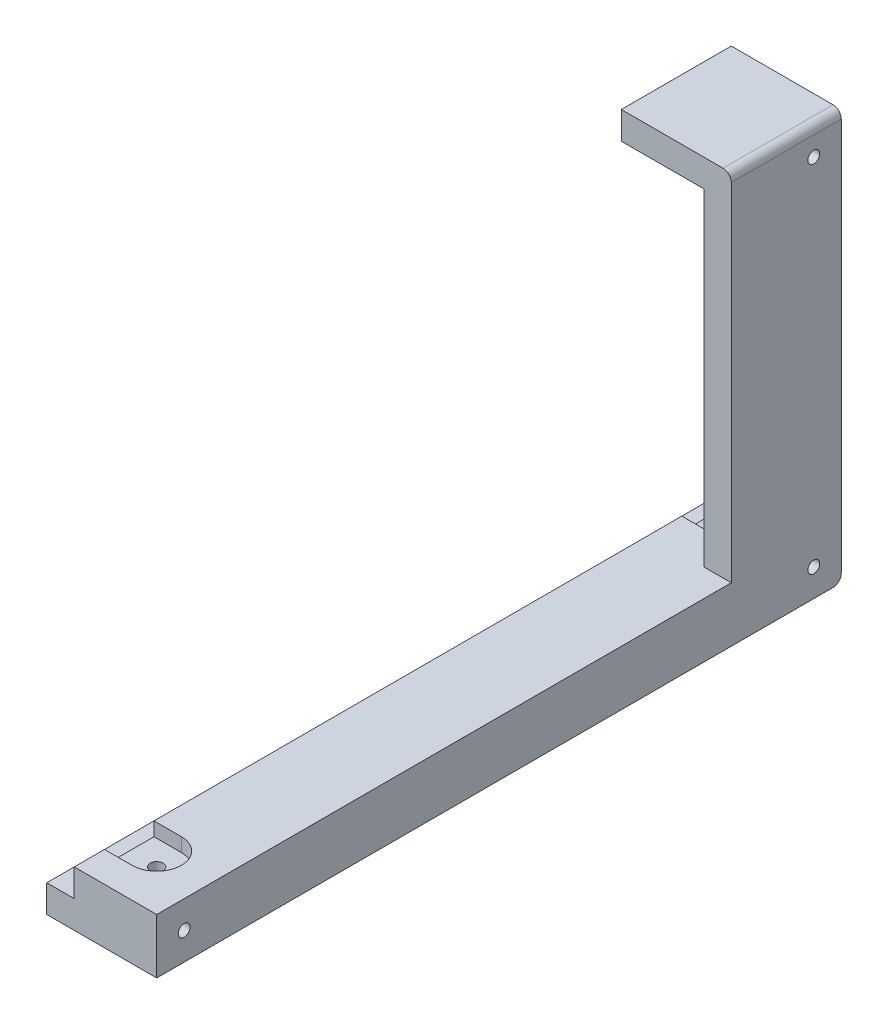
ISO-10303-21;
HEADER;
FILE_DESCRIPTION(('STEP AP214'),'2;1');
FILE_NAME('part.step','',(''),(''),'','','');
FILE_SCHEMA(('AUTOMOTIVE_DESIGN { 1 0 10303 214 1 1 1 1 }'));
ENDSEC;
DATA;
#1=APPLICATION_CONTEXT('core data for automotive mechanical design processes');
#2=APPLICATION_PROTOCOL_DEFINITION('international standard','automotive_design',2000,#1);
#3=PRODUCT_CONTEXT('',#1,'mechanical');
#4=PRODUCT('Part','Part','',(#3));
#5=PRODUCT_RELATED_PRODUCT_CATEGORY('part','',(#4));
#6=PRODUCT_DEFINITION_FORMATION('','',#4);
#7=PRODUCT_DEFINITION_CONTEXT('part definition',#1,'design');
#8=PRODUCT_DEFINITION('design','',#6,#7);
#9=PRODUCT_DEFINITION_SHAPE('','',#8);
#10=(LENGTH_UNIT() NAMED_UNIT(*) SI_UNIT(.MILLI.,.METRE.));
#11=(NAMED_UNIT(*) PLANE_ANGLE_UNIT() SI_UNIT($,.RADIAN.));
#12=(NAMED_UNIT(*) SI_UNIT($,.STERADIAN.) SOLID_ANGLE_UNIT());
#13=UNCERTAINTY_MEASURE_WITH_UNIT(LENGTH_MEASURE(1.E-05),#10,'distance_accuracy_value','');
#14=(GEOMETRIC_REPRESENTATION_CONTEXT(3) GLOBAL_UNCERTAINTY_ASSIGNED_CONTEXT((#13)) GLOBAL_UNIT_ASSIGNED_CONTEXT((#10,
#11,#12)) REPRESENTATION_CONTEXT('',''));
#15=CARTESIAN_POINT('',(0.,0.,0.));
#16=DIRECTION('',(0.,0.,1.));
#17=DIRECTION('',(1.,0.,0.));
#18=AXIS2_PLACEMENT_3D('',#15,#16,#17);
#19=CARTESIAN_POINT('',(0.,-3.00000000000001,-105.5));
#20=DIRECTION('',(0.,1.,0.));
#21=DIRECTION('',(0.,0.,-1.));
#22=AXIS2_PLACEMENT_3D('',#19,#20,#21);
#23=CYLINDRICAL_SURFACE('',#22,2.35);
#24=CARTESIAN_POINT('',(0.,0.,-105.5));
#25=DIRECTION('',(0.,1.,0.));
#26=DIRECTION('',(0.,0.,1.));
#27=AXIS2_PLACEMENT_3D('',#24,#25,#26);
#28=CIRCLE('',#27,2.35);
#29=CARTESIAN_POINT('',(0.,0.,-103.15));
#30=VERTEX_POINT('',#29);
#31=EDGE_CURVE('E253',#30,#30,#28,.T.);
#32=ORIENTED_EDGE('',*,*,#31,.F.);
#33=EDGE_LOOP('',(#32));
#34=FACE_BOUND('',#33,.T.);
#35=CARTESIAN_POINT('',(0.,15.,-105.5));
#36=DIRECTION('',(0.,-1.,0.));
#37=DIRECTION('',(0.,0.,-1.));
#38=AXIS2_PLACEMENT_3D('',#35,#36,#37);
#39=CIRCLE('',#38,2.35);
#40=CARTESIAN_POINT('',(0.,15.,-107.85));
#41=VERTEX_POINT('',#40);
#42=EDGE_CURVE('E263',#41,#41,#39,.F.);
#43=ORIENTED_EDGE('',*,*,#42,.T.);
#44=EDGE_LOOP('',(#43));
#45=FACE_BOUND('',#44,.T.);
#46=ADVANCED_FACE('F39',(#34,#45),#23,.F.);
#47=CARTESIAN_POINT('',(0.,-3.00000000000001,104.5));
#48=DIRECTION('',(0.,1.,0.));
#49=DIRECTION('',(0.,0.,-1.));
#50=AXIS2_PLACEMENT_3D('',#47,#48,#49);
#51=CYLINDRICAL_SURFACE('',#50,2.35);
#52=CARTESIAN_POINT('',(0.,0.,104.5));
#53=DIRECTION('',(0.,1.,0.));
#54=DIRECTION('',(0.,0.,1.));
#55=AXIS2_PLACEMENT_3D('',#52,#53,#54);
#56=CIRCLE('',#55,2.35);
#57=CARTESIAN_POINT('',(0.,0.,106.85));
#58=VERTEX_POINT('',#57);
#59=EDGE_CURVE('E256',#58,#58,#56,.T.);
#60=ORIENTED_EDGE('',*,*,#59,.F.);
#61=EDGE_LOOP('',(#60));
#62=FACE_BOUND('',#61,.T.);
#63=CARTESIAN_POINT('',(0.,15.,104.5));
#64=DIRECTION('',(0.,-1.,0.));
#65=DIRECTION('',(0.,0.,-1.));
#66=AXIS2_PLACEMENT_3D('',#63,#64,#65);
#67=CIRCLE('',#66,2.35);
#68=CARTESIAN_POINT('',(0.,15.,102.15));
#69=VERTEX_POINT('',#68);
#70=EDGE_CURVE('E260',#69,#69,#67,.F.);
#71=ORIENTED_EDGE('',*,*,#70,.T.);
#72=EDGE_LOOP('',(#71));
#73=FACE_BOUND('',#72,.T.);
#74=ADVANCED_FACE('F445',(#62,#73),#51,.F.);
#75=CARTESIAN_POINT('',(-10.,120.,124.5));
#76=DIRECTION('',(-1.,0.,0.));
#77=DIRECTION('',(0.,0.,-1.));
#78=AXIS2_PLACEMENT_3D('',#75,#76,#77);
#79=PLANE('',#78);
#80=DIRECTION('',(0.,1.,0.));
#81=VECTOR('',#80,1.);
#82=CARTESIAN_POINT('',(-9.99999999999997,15.,95.5));
#83=LINE('',#82,#81);
#84=CARTESIAN_POINT('',(-9.99999999999997,15.,95.5));
#85=VERTEX_POINT('',#84);
#86=CARTESIAN_POINT('',(-9.99999999999997,20.,95.5));
#87=VERTEX_POINT('',#86);
#88=EDGE_CURVE('E381',#85,#87,#83,.T.);
#89=ORIENTED_EDGE('',*,*,#88,.T.);
#90=DIRECTION('',(0.,0.,1.));
#91=VECTOR('',#90,1.);
#92=CARTESIAN_POINT('',(-9.99999999999998,20.,0.));
#93=LINE('',#92,#91);
#94=CARTESIAN_POINT('',(-10.,20.,-96.5));
#95=VERTEX_POINT('',#94);
#96=EDGE_CURVE('E212',#95,#87,#93,.T.);
#97=ORIENTED_EDGE('',*,*,#96,.F.);
#98=DIRECTION('',(0.,-1.,0.));
#99=VECTOR('',#98,1.);
#100=CARTESIAN_POINT('',(-9.99999999999997,120.,-96.5));
#101=LINE('',#100,#99);
#102=CARTESIAN_POINT('',(-9.99999999999997,15.,-96.5));
#103=VERTEX_POINT('',#102);
#104=EDGE_CURVE('E257',#95,#103,#101,.T.);
#105=ORIENTED_EDGE('',*,*,#104,.T.);
#106=DIRECTION('',(0.,0.,1.));
#107=VECTOR('',#106,1.);
#108=CARTESIAN_POINT('',(-10.,15.,124.5));
#109=LINE('',#108,#107);
#110=CARTESIAN_POINT('',(-9.99999999999997,15.,-114.5));
#111=VERTEX_POINT('',#110);
#112=EDGE_CURVE('E267',#111,#103,#109,.T.);
#113=ORIENTED_EDGE('',*,*,#112,.F.);
#114=DIRECTION('',(0.,-1.,0.));
#115=VECTOR('',#114,1.);
#116=CARTESIAN_POINT('',(-9.99999999999997,120.,-114.5));
#117=LINE('',#116,#115);
#118=CARTESIAN_POINT('',(-9.99999999999997,10.,-114.5));
#119=VERTEX_POINT('',#118);
#120=EDGE_CURVE('E200',#111,#119,#117,.T.);
#121=ORIENTED_EDGE('',*,*,#120,.T.);
#122=DIRECTION('',(0.,0.,1.));
#123=VECTOR('',#122,1.);
#124=CARTESIAN_POINT('',(-10.,10.,124.5));
#125=LINE('',#124,#123);
#126=CARTESIAN_POINT('',(-10.,10.,124.5));
#127=VERTEX_POINT('',#126);
#128=EDGE_CURVE('E310',#119,#127,#125,.T.);
#129=ORIENTED_EDGE('',*,*,#128,.T.);
#130=DIRECTION('',(0.,-1.,0.));
#131=VECTOR('',#130,1.);
#132=CARTESIAN_POINT('',(-10.,120.,124.5));
#133=LINE('',#132,#131);
#134=CARTESIAN_POINT('',(-10.,20.,124.5));
#135=VERTEX_POINT('',#134);
#136=EDGE_CURVE('E199',#135,#127,#133,.T.);
#137=ORIENTED_EDGE('',*,*,#136,.F.);
#138=CARTESIAN_POINT('',(-9.99999999999997,20.,113.5));
#139=VERTEX_POINT('',#138);
#140=EDGE_CURVE('E203',#139,#135,#93,.T.);
#141=ORIENTED_EDGE('',*,*,#140,.F.);
#142=DIRECTION('',(0.,1.,0.));
#143=VECTOR('',#142,1.);
#144=CARTESIAN_POINT('',(-9.99999999999997,15.,113.5));
#145=LINE('',#144,#143);
#146=CARTESIAN_POINT('',(-9.99999999999997,15.,113.5));
#147=VERTEX_POINT('',#146);
#148=EDGE_CURVE('E377',#147,#139,#145,.T.);
#149=ORIENTED_EDGE('',*,*,#148,.F.);
#150=DIRECTION('',(0.,0.,-1.));
#151=VECTOR('',#150,1.);
#152=CARTESIAN_POINT('',(-9.99999999999997,15.,95.5));
#153=LINE('',#152,#151);
#154=EDGE_CURVE('E391',#147,#85,#153,.T.);
#155=ORIENTED_EDGE('',*,*,#154,.T.);
#156=EDGE_LOOP('',(#89,#97,#105,#113,#121,#129,#137,#141,#149,#155));
#157=FACE_BOUND('',#156,.T.);
#158=ADVANCED_FACE('F322',(#157),#79,.T.);
#159=CARTESIAN_POINT('',(0.,20.,0.));
#160=DIRECTION('',(0.,-1.,0.));
#161=DIRECTION('',(0.,0.,1.));
#162=AXIS2_PLACEMENT_3D('',#159,#160,#161);
#163=PLANE('',#162);
#164=CARTESIAN_POINT('',(0.,20.,104.5));
#165=DIRECTION('',(0.,-1.,0.));
#166=DIRECTION('',(0.,0.,-1.));
#167=AXIS2_PLACEMENT_3D('',#164,#165,#166);
#168=CIRCLE('',#167,8.99999999999999);
#169=CARTESIAN_POINT('',(0.,20.,95.5));
#170=VERTEX_POINT('',#169);
#171=CARTESIAN_POINT('',(0.,20.,113.5));
#172=VERTEX_POINT('',#171);
#173=EDGE_CURVE('E357',#170,#172,#168,.T.);
#174=ORIENTED_EDGE('',*,*,#173,.T.);
#175=DIRECTION('',(-1.,0.,0.));
#176=VECTOR('',#175,1.);
#177=CARTESIAN_POINT('',(-9.99999999999997,20.,113.5));
#178=LINE('',#177,#176);
#179=EDGE_CURVE('E360',#172,#139,#178,.T.);
#180=ORIENTED_EDGE('',*,*,#179,.T.);
#181=ORIENTED_EDGE('',*,*,#140,.T.);
#182=DIRECTION('',(-1.,0.,0.));
#183=VECTOR('',#182,1.);
#184=CARTESIAN_POINT('',(-20.,20.,124.5));
#185=LINE('',#184,#183);
#186=CARTESIAN_POINT('',(20.,20.,124.5));
#187=VERTEX_POINT('',#186);
#188=EDGE_CURVE('E232',#187,#135,#185,.T.);
#189=ORIENTED_EDGE('',*,*,#188,.F.);
#190=DIRECTION('',(0.,0.,1.));
#191=VECTOR('',#190,1.);
#192=CARTESIAN_POINT('',(20.,20.,-124.5));
#193=LINE('',#192,#191);
#194=CARTESIAN_POINT('',(20.,20.,-84.5));
#195=VERTEX_POINT('',#194);
#196=EDGE_CURVE('E229',#195,#187,#193,.T.);
#197=ORIENTED_EDGE('',*,*,#196,.F.);
#198=DIRECTION('',(-1.,0.,0.));
#199=VECTOR('',#198,1.);
#200=CARTESIAN_POINT('',(-20.,20.,-84.5));
#201=LINE('',#200,#199);
#202=CARTESIAN_POINT('',(10.,20.,-84.5));
#203=VERTEX_POINT('',#202);
#204=EDGE_CURVE('E217',#195,#203,#201,.T.);
#205=ORIENTED_EDGE('',*,*,#204,.T.);
#206=DIRECTION('',(0.,0.,-1.));
#207=VECTOR('',#206,1.);
#208=CARTESIAN_POINT('',(10.,20.,-114.5));
#209=LINE('',#208,#207);
#210=CARTESIAN_POINT('',(10.,20.,-114.5));
#211=VERTEX_POINT('',#210);
#212=EDGE_CURVE('E338',#203,#211,#209,.T.);
#213=ORIENTED_EDGE('',*,*,#212,.T.);
#214=DIRECTION('',(-1.,0.,0.));
#215=VECTOR('',#214,1.);
#216=CARTESIAN_POINT('',(10.,20.,-114.5));
#217=LINE('',#216,#215);
#218=CARTESIAN_POINT('',(0.,20.,-114.5));
#219=VERTEX_POINT('',#218);
#220=EDGE_CURVE('E313',#211,#219,#217,.T.);
#221=ORIENTED_EDGE('',*,*,#220,.T.);
#222=CARTESIAN_POINT('',(0.,20.,-105.5));
#223=DIRECTION('',(0.,-1.,0.));
#224=DIRECTION('',(0.,0.,-1.));
#225=AXIS2_PLACEMENT_3D('',#222,#223,#224);
#226=CIRCLE('',#225,8.99999999999999);
#227=CARTESIAN_POINT('',(0.,20.,-96.5));
#228=VERTEX_POINT('',#227);
#229=EDGE_CURVE('E346',#219,#228,#226,.T.);
#230=ORIENTED_EDGE('',*,*,#229,.T.);
#231=DIRECTION('',(-1.,0.,0.));
#232=VECTOR('',#231,1.);
#233=CARTESIAN_POINT('',(0.,20.,-96.5));
#234=LINE('',#233,#232);
#235=EDGE_CURVE('E358',#228,#95,#234,.T.);
#236=ORIENTED_EDGE('',*,*,#235,.T.);
#237=ORIENTED_EDGE('',*,*,#96,.T.);
#238=DIRECTION('',(1.,0.,0.));
#239=VECTOR('',#238,1.);
#240=CARTESIAN_POINT('',(0.,20.,95.5));
#241=LINE('',#240,#239);
#242=EDGE_CURVE('E384',#87,#170,#241,.T.);
#243=ORIENTED_EDGE('',*,*,#242,.T.);
#244=EDGE_LOOP('',(#174,#180,#181,#189,#197,#205,#213,#221,#230,#236,#237,#243));
#245=FACE_BOUND('',#244,.T.);
#246=ADVANCED_FACE('F344',(#245),#163,.F.);
#247=CARTESIAN_POINT('',(-20.,20.,124.5));
#248=DIRECTION('',(0.,0.,-1.));
#249=DIRECTION('',(1.,0.,0.));
#250=AXIS2_PLACEMENT_3D('',#247,#248,#249);
#251=PLANE('',#250);
#252=ORIENTED_EDGE('',*,*,#136,.T.);
#253=DIRECTION('',(-1.,0.,0.));
#254=VECTOR('',#253,1.);
#255=CARTESIAN_POINT('',(-10.,10.,124.5));
#256=LINE('',#255,#254);
#257=CARTESIAN_POINT('',(-20.,10.,124.5));
#258=VERTEX_POINT('',#257);
#259=EDGE_CURVE('E305',#127,#258,#256,.T.);
#260=ORIENTED_EDGE('',*,*,#259,.T.);
#261=DIRECTION('',(0.,-1.,0.));
#262=VECTOR('',#261,1.);
#263=CARTESIAN_POINT('',(-20.,20.,124.5));
#264=LINE('',#263,#262);
#265=CARTESIAN_POINT('',(-20.,0.,124.5));
#266=VERTEX_POINT('',#265);
#267=EDGE_CURVE('E246',#258,#266,#264,.T.);
#268=ORIENTED_EDGE('',*,*,#267,.T.);
#269=DIRECTION('',(-1.,0.,0.));
#270=VECTOR('',#269,1.);
#271=CARTESIAN_POINT('',(-20.,0.,124.5));
#272=LINE('',#271,#270);
#273=CARTESIAN_POINT('',(20.,0.,124.5));
#274=VERTEX_POINT('',#273);
#275=EDGE_CURVE('E237',#274,#266,#272,.T.);
#276=ORIENTED_EDGE('',*,*,#275,.F.);
#277=DIRECTION('',(0.,-1.,0.));
#278=VECTOR('',#277,1.);
#279=CARTESIAN_POINT('',(20.,20.,124.5));
#280=LINE('',#279,#278);
#281=EDGE_CURVE('E249',#187,#274,#280,.T.);
#282=ORIENTED_EDGE('',*,*,#281,.F.);
#283=ORIENTED_EDGE('',*,*,#188,.T.);
#284=EDGE_LOOP('',(#252,#260,#268,#276,#282,#283));
#285=FACE_BOUND('',#284,.T.);
#286=ADVANCED_FACE('F304',(#285),#251,.F.);
#287=CARTESIAN_POINT('',(-20.,20.,-124.5));
#288=DIRECTION('',(1.,0.,0.));
#289=DIRECTION('',(0.,0.,1.));
#290=AXIS2_PLACEMENT_3D('',#287,#288,#289);
#291=PLANE('',#290);
#292=DIRECTION('',(0.,0.,-1.));
#293=VECTOR('',#292,1.);
#294=CARTESIAN_POINT('',(-20.,0.,-124.5));
#295=LINE('',#294,#293);
#296=CARTESIAN_POINT('',(-20.,0.,-121.5));
#297=VERTEX_POINT('',#296);
#298=EDGE_CURVE('E233',#266,#297,#295,.T.);
#299=ORIENTED_EDGE('',*,*,#298,.F.);
#300=ORIENTED_EDGE('',*,*,#267,.F.);
#301=DIRECTION('',(0.,0.,-1.));
#302=VECTOR('',#301,1.);
#303=CARTESIAN_POINT('',(-20.,10.,124.5));
#304=LINE('',#303,#302);
#305=CARTESIAN_POINT('',(-20.,10.,-114.5));
#306=VERTEX_POINT('',#305);
#307=EDGE_CURVE('E198',#258,#306,#304,.T.);
#308=ORIENTED_EDGE('',*,*,#307,.T.);
#309=DIRECTION('',(0.,-1.,0.));
#310=VECTOR('',#309,1.);
#311=CARTESIAN_POINT('',(-20.,120.,-114.5));
#312=LINE('',#311,#310);
#313=CARTESIAN_POINT('',(-20.,139.09,-114.5));
#314=VERTEX_POINT('',#313);
#315=EDGE_CURVE('E180',#314,#306,#312,.T.);
#316=ORIENTED_EDGE('',*,*,#315,.F.);
#317=DIRECTION('',(0.,0.,1.));
#318=VECTOR('',#317,1.);
#319=CARTESIAN_POINT('',(-20.,139.09,-114.5));
#320=LINE('',#319,#318);
#321=CARTESIAN_POINT('',(-20.,139.09,-84.5));
#322=VERTEX_POINT('',#321);
#323=EDGE_CURVE('E185',#314,#322,#320,.T.);
#324=ORIENTED_EDGE('',*,*,#323,.T.);
#325=DIRECTION('',(0.,-1.,0.));
#326=VECTOR('',#325,1.);
#327=CARTESIAN_POINT('',(-20.,149.09,-84.5));
#328=LINE('',#327,#326);
#329=CARTESIAN_POINT('',(-20.,149.09,-84.5));
#330=VERTEX_POINT('',#329);
#331=EDGE_CURVE('E222',#330,#322,#328,.T.);
#332=ORIENTED_EDGE('',*,*,#331,.F.);
#333=DIRECTION('',(0.,0.,-1.));
#334=VECTOR('',#333,1.);
#335=CARTESIAN_POINT('',(-20.,149.09,-124.5));
#336=LINE('',#335,#334);
#337=CARTESIAN_POINT('',(-20.,149.09,-124.5));
#338=VERTEX_POINT('',#337);
#339=EDGE_CURVE('E213',#330,#338,#336,.T.);
#340=ORIENTED_EDGE('',*,*,#339,.T.);
#341=DIRECTION('',(0.,-1.,0.));
#342=VECTOR('',#341,1.);
#343=CARTESIAN_POINT('',(-20.,20.,-124.5));
#344=LINE('',#343,#342);
#345=CARTESIAN_POINT('',(-20.,3.,-124.5));
#346=VERTEX_POINT('',#345);
#347=EDGE_CURVE('E243',#338,#346,#344,.T.);
#348=ORIENTED_EDGE('',*,*,#347,.T.);
#349=CARTESIAN_POINT('',(-20.,3.,-121.5));
#350=DIRECTION('',(-1.,0.,0.));
#351=DIRECTION('',(0.,0.,1.));
#352=AXIS2_PLACEMENT_3D('',#349,#350,#351);
#353=CIRCLE('',#352,3.);
#354=EDGE_CURVE('E11',#297,#346,#353,.F.);
#355=ORIENTED_EDGE('',*,*,#354,.F.);
#356=EDGE_LOOP('',(#299,#300,#308,#316,#324,#332,#340,#348,#355));
#357=FACE_BOUND('',#356,.T.);
#358=ADVANCED_FACE('F196',(#357),#291,.F.);
#359=CARTESIAN_POINT('',(-20.,149.09,-84.5));
#360=DIRECTION('',(0.,0.,-1.));
#361=DIRECTION('',(1.,0.,0.));
#362=AXIS2_PLACEMENT_3D('',#359,#360,#361);
#363=PLANE('',#362);
#364=DIRECTION('',(-1.,0.,0.));
#365=VECTOR('',#364,1.);
#366=CARTESIAN_POINT('',(-20.,149.09,-84.5));
#367=LINE('',#366,#365);
#368=CARTESIAN_POINT('',(17.,149.09,-84.5));
#369=VERTEX_POINT('',#368);
#370=EDGE_CURVE('E220',#369,#330,#367,.T.);
#371=ORIENTED_EDGE('',*,*,#370,.T.);
#372=ORIENTED_EDGE('',*,*,#331,.T.);
#373=DIRECTION('',(1.,0.,0.));
#374=VECTOR('',#373,1.);
#375=CARTESIAN_POINT('',(-20.,139.09,-84.5));
#376=LINE('',#375,#374);
#377=CARTESIAN_POINT('',(9.99999999999999,139.09,-84.5));
#378=VERTEX_POINT('',#377);
#379=EDGE_CURVE('E186',#322,#378,#376,.T.);
#380=ORIENTED_EDGE('',*,*,#379,.T.);
#381=DIRECTION('',(0.,-1.,0.));
#382=VECTOR('',#381,1.);
#383=CARTESIAN_POINT('',(10.,20.,-84.5));
#384=LINE('',#383,#382);
#385=EDGE_CURVE('E336',#378,#203,#384,.T.);
#386=ORIENTED_EDGE('',*,*,#385,.T.);
#387=ORIENTED_EDGE('',*,*,#204,.F.);
#388=DIRECTION('',(0.,-1.,0.));
#389=VECTOR('',#388,1.);
#390=CARTESIAN_POINT('',(20.,149.09,-84.5));
#391=LINE('',#390,#389);
#392=CARTESIAN_POINT('',(20.,146.09,-84.5));
#393=VERTEX_POINT('',#392);
#394=EDGE_CURVE('E226',#393,#195,#391,.T.);
#395=ORIENTED_EDGE('',*,*,#394,.F.);
#396=CARTESIAN_POINT('',(17.,146.09,-84.5));
#397=DIRECTION('',(0.,0.,1.));
#398=DIRECTION('',(1.,0.,0.));
#399=AXIS2_PLACEMENT_3D('',#396,#397,#398);
#400=CIRCLE('',#399,3.);
#401=EDGE_CURVE('E269',#369,#393,#400,.F.);
#402=ORIENTED_EDGE('',*,*,#401,.F.);
#403=EDGE_LOOP('',(#371,#372,#380,#386,#387,#395,#402));
#404=FACE_BOUND('',#403,.T.);
#405=ADVANCED_FACE('F290',(#404),#363,.F.);
#406=CARTESIAN_POINT('',(20.,20.,-124.5));
#407=DIRECTION('',(-1.,0.,0.));
#408=DIRECTION('',(0.,0.,-1.));
#409=AXIS2_PLACEMENT_3D('',#406,#407,#408);
#410=PLANE('',#409);
#411=CARTESIAN_POINT('',(20.,10.,114.5));
#412=DIRECTION('',(-1.,0.,0.));
#413=DIRECTION('',(0.,0.,1.));
#414=AXIS2_PLACEMENT_3D('',#411,#412,#413);
#415=CIRCLE('',#414,2.175);
#416=CARTESIAN_POINT('',(20.,10.,116.675));
#417=VERTEX_POINT('',#416);
#418=EDGE_CURVE('E372',#417,#417,#415,.T.);
#419=ORIENTED_EDGE('',*,*,#418,.T.);
#420=EDGE_LOOP('',(#419));
#421=FACE_BOUND('',#420,.T.);
#422=CARTESIAN_POINT('',(20.,10.,-114.5));
#423=DIRECTION('',(-1.,0.,0.));
#424=DIRECTION('',(0.,0.,1.));
#425=AXIS2_PLACEMENT_3D('',#422,#423,#424);
#426=CIRCLE('',#425,2.175);
#427=CARTESIAN_POINT('',(20.,10.,-112.325));
#428=VERTEX_POINT('',#427);
#429=EDGE_CURVE('E407',#428,#428,#426,.T.);
#430=ORIENTED_EDGE('',*,*,#429,.T.);
#431=EDGE_LOOP('',(#430));
#432=FACE_BOUND('',#431,.T.);
#433=CARTESIAN_POINT('',(20.,139.09,-114.5));
#434=DIRECTION('',(-1.,0.,0.));
#435=DIRECTION('',(0.,0.,1.));
#436=AXIS2_PLACEMENT_3D('',#433,#434,#435);
#437=CIRCLE('',#436,2.175);
#438=CARTESIAN_POINT('',(20.,139.09,-112.325));
#439=VERTEX_POINT('',#438);
#440=EDGE_CURVE('E401',#439,#439,#437,.T.);
#441=ORIENTED_EDGE('',*,*,#440,.T.);
#442=EDGE_LOOP('',(#441));
#443=FACE_BOUND('',#442,.T.);
#444=ORIENTED_EDGE('',*,*,#394,.T.);
#445=ORIENTED_EDGE('',*,*,#196,.T.);
#446=ORIENTED_EDGE('',*,*,#281,.T.);
#447=DIRECTION('',(0.,0.,1.));
#448=VECTOR('',#447,1.);
#449=CARTESIAN_POINT('',(20.,0.,-124.5));
#450=LINE('',#449,#448);
#451=CARTESIAN_POINT('',(20.,0.,-121.5));
#452=VERTEX_POINT('',#451);
#453=EDGE_CURVE('E228',#452,#274,#450,.T.);
#454=ORIENTED_EDGE('',*,*,#453,.F.);
#455=CARTESIAN_POINT('',(20.,3.,-121.5));
#456=DIRECTION('',(1.,0.,0.));
#457=DIRECTION('',(0.,0.,-1.));
#458=AXIS2_PLACEMENT_3D('',#455,#456,#457);
#459=CIRCLE('',#458,3.);
#460=CARTESIAN_POINT('',(20.,3.,-124.5));
#461=VERTEX_POINT('',#460);
#462=EDGE_CURVE('E272',#461,#452,#459,.F.);
#463=ORIENTED_EDGE('',*,*,#462,.F.);
#464=DIRECTION('',(0.,-1.,0.));
#465=VECTOR('',#464,1.);
#466=CARTESIAN_POINT('',(20.,20.,-124.5));
#467=LINE('',#466,#465);
#468=CARTESIAN_POINT('',(20.,146.09,-124.5));
#469=VERTEX_POINT('',#468);
#470=EDGE_CURVE('E235',#469,#461,#467,.T.);
#471=ORIENTED_EDGE('',*,*,#470,.F.);
#472=DIRECTION('',(0.,0.,1.));
#473=VECTOR('',#472,1.);
#474=CARTESIAN_POINT('',(20.,146.09,-124.5));
#475=LINE('',#474,#473);
#476=EDGE_CURVE('E274',#393,#469,#475,.F.);
#477=ORIENTED_EDGE('',*,*,#476,.F.);
#478=EDGE_LOOP('',(#444,#445,#446,#454,#463,#471,#477));
#479=FACE_BOUND('',#478,.T.);
#480=ADVANCED_FACE('F295',(#421,#432,#443,#479),#410,.F.);
#481=CARTESIAN_POINT('',(-20.,20.,-124.5));
#482=DIRECTION('',(0.,0.,1.));
#483=DIRECTION('',(-1.,0.,0.));
#484=AXIS2_PLACEMENT_3D('',#481,#482,#483);
#485=PLANE('',#484);
#486=ORIENTED_EDGE('',*,*,#470,.T.);
#487=DIRECTION('',(1.,0.,0.));
#488=VECTOR('',#487,1.);
#489=CARTESIAN_POINT('',(20.,3.,-124.5));
#490=LINE('',#489,#488);
#491=EDGE_CURVE('E60',#346,#461,#490,.T.);
#492=ORIENTED_EDGE('',*,*,#491,.F.);
#493=ORIENTED_EDGE('',*,*,#347,.F.);
#494=DIRECTION('',(1.,0.,0.));
#495=VECTOR('',#494,1.);
#496=CARTESIAN_POINT('',(-20.,149.09,-124.5));
#497=LINE('',#496,#495);
#498=CARTESIAN_POINT('',(17.,149.09,-124.5));
#499=VERTEX_POINT('',#498);
#500=EDGE_CURVE('E216',#338,#499,#497,.T.);
#501=ORIENTED_EDGE('',*,*,#500,.T.);
#502=CARTESIAN_POINT('',(17.,146.09,-124.5));
#503=DIRECTION('',(0.,0.,-1.));
#504=DIRECTION('',(-1.,0.,0.));
#505=AXIS2_PLACEMENT_3D('',#502,#503,#504);
#506=CIRCLE('',#505,3.);
#507=EDGE_CURVE('E278',#469,#499,#506,.F.);
#508=ORIENTED_EDGE('',*,*,#507,.F.);
#509=EDGE_LOOP('',(#486,#492,#493,#501,#508));
#510=FACE_BOUND('',#509,.T.);
#511=ADVANCED_FACE('F284',(#510),#485,.F.);
#512=CARTESIAN_POINT('',(0.,0.,0.));
#513=DIRECTION('',(0.,-1.,0.));
#514=DIRECTION('',(0.,0.,1.));
#515=AXIS2_PLACEMENT_3D('',#512,#513,#514);
#516=PLANE('',#515);
#517=ORIENTED_EDGE('',*,*,#59,.T.);
#518=EDGE_LOOP('',(#517));
#519=FACE_BOUND('',#518,.T.);
#520=ORIENTED_EDGE('',*,*,#31,.T.);
#521=EDGE_LOOP('',(#520));
#522=FACE_BOUND('',#521,.T.);
#523=ORIENTED_EDGE('',*,*,#453,.T.);
#524=ORIENTED_EDGE('',*,*,#275,.T.);
#525=ORIENTED_EDGE('',*,*,#298,.T.);
#526=DIRECTION('',(1.,0.,0.));
#527=VECTOR('',#526,1.);
#528=CARTESIAN_POINT('',(-20.,0.,-121.5));
#529=LINE('',#528,#527);
#530=EDGE_CURVE('E47',#452,#297,#529,.F.);
#531=ORIENTED_EDGE('',*,*,#530,.F.);
#532=EDGE_LOOP('',(#523,#524,#525,#531));
#533=FACE_BOUND('',#532,.T.);
#534=ADVANCED_FACE('F300',(#519,#522,#533),#516,.T.);
#535=CARTESIAN_POINT('',(0.,149.09,0.));
#536=DIRECTION('',(0.,-1.,0.));
#537=DIRECTION('',(0.,0.,1.));
#538=AXIS2_PLACEMENT_3D('',#535,#536,#537);
#539=PLANE('',#538);
#540=ORIENTED_EDGE('',*,*,#500,.F.);
#541=ORIENTED_EDGE('',*,*,#339,.F.);
#542=ORIENTED_EDGE('',*,*,#370,.F.);
#543=DIRECTION('',(0.,0.,1.));
#544=VECTOR('',#543,1.);
#545=CARTESIAN_POINT('',(17.,149.09,0.));
#546=LINE('',#545,#544);
#547=EDGE_CURVE('E252',#499,#369,#546,.T.);
#548=ORIENTED_EDGE('',*,*,#547,.F.);
#549=EDGE_LOOP('',(#540,#541,#542,#548));
#550=FACE_BOUND('',#549,.T.);
#551=ADVANCED_FACE('F287',(#550),#539,.F.);
#552=CARTESIAN_POINT('',(-9.99999999999997,120.,-114.5));
#553=DIRECTION('',(0.,0.,1.));
#554=DIRECTION('',(-1.,0.,0.));
#555=AXIS2_PLACEMENT_3D('',#552,#553,#554);
#556=PLANE('',#555);
#557=DIRECTION('',(1.,0.,0.));
#558=VECTOR('',#557,1.);
#559=CARTESIAN_POINT('',(-9.99999999999997,10.,-114.5));
#560=LINE('',#559,#558);
#561=EDGE_CURVE('E206',#306,#119,#560,.T.);
#562=ORIENTED_EDGE('',*,*,#561,.T.);
#563=ORIENTED_EDGE('',*,*,#120,.F.);
#564=DIRECTION('',(1.,0.,0.));
#565=VECTOR('',#564,1.);
#566=CARTESIAN_POINT('',(-20.,15.,-114.5));
#567=LINE('',#566,#565);
#568=CARTESIAN_POINT('',(0.,15.,-114.5));
#569=VERTEX_POINT('',#568);
#570=EDGE_CURVE('E332',#111,#569,#567,.T.);
#571=ORIENTED_EDGE('',*,*,#570,.T.);
#572=DIRECTION('',(0.,1.,0.));
#573=VECTOR('',#572,1.);
#574=CARTESIAN_POINT('',(0.,15.,-114.5));
#575=LINE('',#574,#573);
#576=EDGE_CURVE('E349',#569,#219,#575,.T.);
#577=ORIENTED_EDGE('',*,*,#576,.T.);
#578=ORIENTED_EDGE('',*,*,#220,.F.);
#579=DIRECTION('',(0.,1.,0.));
#580=VECTOR('',#579,1.);
#581=CARTESIAN_POINT('',(10.,20.,-114.5));
#582=LINE('',#581,#580);
#583=CARTESIAN_POINT('',(9.99999999999999,139.09,-114.5));
#584=VERTEX_POINT('',#583);
#585=EDGE_CURVE('E183',#211,#584,#582,.T.);
#586=ORIENTED_EDGE('',*,*,#585,.T.);
#587=DIRECTION('',(1.,0.,0.));
#588=VECTOR('',#587,1.);
#589=CARTESIAN_POINT('',(-20.,139.09,-114.5));
#590=LINE('',#589,#588);
#591=EDGE_CURVE('E176',#314,#584,#590,.T.);
#592=ORIENTED_EDGE('',*,*,#591,.F.);
#593=ORIENTED_EDGE('',*,*,#315,.T.);
#594=EDGE_LOOP('',(#562,#563,#571,#577,#578,#586,#592,#593));
#595=FACE_BOUND('',#594,.T.);
#596=ADVANCED_FACE('F178',(#595),#556,.T.);
#597=CARTESIAN_POINT('',(0.,10.,0.));
#598=DIRECTION('',(0.,-1.,0.));
#599=DIRECTION('',(0.,0.,1.));
#600=AXIS2_PLACEMENT_3D('',#597,#598,#599);
#601=PLANE('',#600);
#602=ORIENTED_EDGE('',*,*,#128,.F.);
#603=ORIENTED_EDGE('',*,*,#561,.F.);
#604=ORIENTED_EDGE('',*,*,#307,.F.);
#605=ORIENTED_EDGE('',*,*,#259,.F.);
#606=EDGE_LOOP('',(#602,#603,#604,#605));
#607=FACE_BOUND('',#606,.T.);
#608=ADVANCED_FACE('F319',(#607),#601,.F.);
#609=CARTESIAN_POINT('',(10.,0.,0.));
#610=DIRECTION('',(-1.,0.,0.));
#611=DIRECTION('',(0.,0.,-1.));
#612=AXIS2_PLACEMENT_3D('',#609,#610,#611);
#613=PLANE('',#612);
#614=ORIENTED_EDGE('',*,*,#585,.F.);
#615=ORIENTED_EDGE('',*,*,#212,.F.);
#616=ORIENTED_EDGE('',*,*,#385,.F.);
#617=DIRECTION('',(0.,0.,1.));
#618=VECTOR('',#617,1.);
#619=CARTESIAN_POINT('',(9.99999999999999,139.09,-114.5));
#620=LINE('',#619,#618);
#621=EDGE_CURVE('E194',#584,#378,#620,.T.);
#622=ORIENTED_EDGE('',*,*,#621,.F.);
#623=EDGE_LOOP('',(#614,#615,#616,#622));
#624=FACE_BOUND('',#623,.T.);
#625=ADVANCED_FACE('F415',(#624),#613,.T.);
#626=CARTESIAN_POINT('',(0.,15.,104.5));
#627=DIRECTION('',(0.,1.,0.));
#628=DIRECTION('',(0.,0.,-1.));
#629=AXIS2_PLACEMENT_3D('',#626,#627,#628);
#630=PLANE('',#629);
#631=CARTESIAN_POINT('',(0.,15.,104.5));
#632=DIRECTION('',(0.,-1.,0.));
#633=DIRECTION('',(0.,0.,-1.));
#634=AXIS2_PLACEMENT_3D('',#631,#632,#633);
#635=CIRCLE('',#634,8.99999999999999);
#636=CARTESIAN_POINT('',(0.,15.,95.5));
#637=VERTEX_POINT('',#636);
#638=CARTESIAN_POINT('',(0.,15.,113.5));
#639=VERTEX_POINT('',#638);
#640=EDGE_CURVE('E387',#637,#639,#635,.T.);
#641=ORIENTED_EDGE('',*,*,#640,.F.);
#642=DIRECTION('',(1.,0.,0.));
#643=VECTOR('',#642,1.);
#644=CARTESIAN_POINT('',(0.,15.,95.5));
#645=LINE('',#644,#643);
#646=EDGE_CURVE('E378',#85,#637,#645,.T.);
#647=ORIENTED_EDGE('',*,*,#646,.F.);
#648=ORIENTED_EDGE('',*,*,#154,.F.);
#649=DIRECTION('',(-1.,0.,0.));
#650=VECTOR('',#649,1.);
#651=CARTESIAN_POINT('',(-9.99999999999997,15.,113.5));
#652=LINE('',#651,#650);
#653=EDGE_CURVE('E394',#639,#147,#652,.T.);
#654=ORIENTED_EDGE('',*,*,#653,.F.);
#655=EDGE_LOOP('',(#641,#647,#648,#654));
#656=FACE_BOUND('',#655,.T.);
#657=ORIENTED_EDGE('',*,*,#70,.F.);
#658=EDGE_LOOP('',(#657));
#659=FACE_BOUND('',#658,.T.);
#660=ADVANCED_FACE('F426',(#656,#659),#630,.T.);
#661=CARTESIAN_POINT('',(0.,15.,104.5));
#662=DIRECTION('',(0.,1.,0.));
#663=DIRECTION('',(0.,0.,-1.));
#664=AXIS2_PLACEMENT_3D('',#661,#662,#663);
#665=CYLINDRICAL_SURFACE('',#664,8.99999999999999);
#666=ORIENTED_EDGE('',*,*,#173,.F.);
#667=DIRECTION('',(0.,1.,0.));
#668=VECTOR('',#667,1.);
#669=CARTESIAN_POINT('',(0.,15.,95.5));
#670=LINE('',#669,#668);
#671=EDGE_CURVE('E264',#637,#170,#670,.T.);
#672=ORIENTED_EDGE('',*,*,#671,.F.);
#673=ORIENTED_EDGE('',*,*,#640,.T.);
#674=DIRECTION('',(0.,1.,0.));
#675=VECTOR('',#674,1.);
#676=CARTESIAN_POINT('',(0.,15.,113.5));
#677=LINE('',#676,#675);
#678=EDGE_CURVE('E375',#639,#172,#677,.T.);
#679=ORIENTED_EDGE('',*,*,#678,.T.);
#680=EDGE_LOOP('',(#666,#672,#673,#679));
#681=FACE_BOUND('',#680,.T.);
#682=ADVANCED_FACE('F433',(#681),#665,.F.);
#683=CARTESIAN_POINT('',(0.,15.,95.5));
#684=DIRECTION('',(0.,0.,-1.));
#685=DIRECTION('',(1.,0.,0.));
#686=AXIS2_PLACEMENT_3D('',#683,#684,#685);
#687=PLANE('',#686);
#688=ORIENTED_EDGE('',*,*,#242,.F.);
#689=ORIENTED_EDGE('',*,*,#88,.F.);
#690=ORIENTED_EDGE('',*,*,#646,.T.);
#691=ORIENTED_EDGE('',*,*,#671,.T.);
#692=EDGE_LOOP('',(#688,#689,#690,#691));
#693=FACE_BOUND('',#692,.T.);
#694=ADVANCED_FACE('F429',(#693),#687,.F.);
#695=CARTESIAN_POINT('',(-9.99999999999997,15.,113.5));
#696=DIRECTION('',(0.,0.,1.));
#697=DIRECTION('',(-1.,0.,0.));
#698=AXIS2_PLACEMENT_3D('',#695,#696,#697);
#699=PLANE('',#698);
#700=ORIENTED_EDGE('',*,*,#179,.F.);
#701=ORIENTED_EDGE('',*,*,#678,.F.);
#702=ORIENTED_EDGE('',*,*,#653,.T.);
#703=ORIENTED_EDGE('',*,*,#148,.T.);
#704=EDGE_LOOP('',(#700,#701,#702,#703));
#705=FACE_BOUND('',#704,.T.);
#706=ADVANCED_FACE('F422',(#705),#699,.F.);
#707=CARTESIAN_POINT('',(0.,15.,-105.5));
#708=DIRECTION('',(0.,1.,0.));
#709=DIRECTION('',(0.,0.,-1.));
#710=AXIS2_PLACEMENT_3D('',#707,#708,#709);
#711=PLANE('',#710);
#712=ORIENTED_EDGE('',*,*,#570,.F.);
#713=ORIENTED_EDGE('',*,*,#112,.T.);
#714=DIRECTION('',(-1.,0.,0.));
#715=VECTOR('',#714,1.);
#716=CARTESIAN_POINT('',(0.,15.,-96.5));
#717=LINE('',#716,#715);
#718=CARTESIAN_POINT('',(0.,15.,-96.5));
#719=VERTEX_POINT('',#718);
#720=EDGE_CURVE('E352',#719,#103,#717,.T.);
#721=ORIENTED_EDGE('',*,*,#720,.F.);
#722=CARTESIAN_POINT('',(0.,15.,-105.5));
#723=DIRECTION('',(0.,-1.,0.));
#724=DIRECTION('',(0.,0.,-1.));
#725=AXIS2_PLACEMENT_3D('',#722,#723,#724);
#726=CIRCLE('',#725,8.99999999999999);
#727=EDGE_CURVE('E365',#569,#719,#726,.T.);
#728=ORIENTED_EDGE('',*,*,#727,.F.);
#729=EDGE_LOOP('',(#712,#713,#721,#728));
#730=FACE_BOUND('',#729,.T.);
#731=ORIENTED_EDGE('',*,*,#42,.F.);
#732=EDGE_LOOP('',(#731));
#733=FACE_BOUND('',#732,.T.);
#734=ADVANCED_FACE('F366',(#730,#733),#711,.T.);
#735=CARTESIAN_POINT('',(0.,15.,-96.5));
#736=DIRECTION('',(0.,0.,1.));
#737=DIRECTION('',(-1.,0.,0.));
#738=AXIS2_PLACEMENT_3D('',#735,#736,#737);
#739=PLANE('',#738);
#740=ORIENTED_EDGE('',*,*,#104,.F.);
#741=ORIENTED_EDGE('',*,*,#235,.F.);
#742=DIRECTION('',(0.,1.,0.));
#743=VECTOR('',#742,1.);
#744=CARTESIAN_POINT('',(0.,15.,-96.5));
#745=LINE('',#744,#743);
#746=EDGE_CURVE('E353',#719,#228,#745,.T.);
#747=ORIENTED_EDGE('',*,*,#746,.F.);
#748=ORIENTED_EDGE('',*,*,#720,.T.);
#749=EDGE_LOOP('',(#740,#741,#747,#748));
#750=FACE_BOUND('',#749,.T.);
#751=ADVANCED_FACE('F369',(#750),#739,.F.);
#752=CARTESIAN_POINT('',(0.,15.,-105.5));
#753=DIRECTION('',(0.,1.,0.));
#754=DIRECTION('',(0.,0.,-1.));
#755=AXIS2_PLACEMENT_3D('',#752,#753,#754);
#756=CYLINDRICAL_SURFACE('',#755,8.99999999999999);
#757=ORIENTED_EDGE('',*,*,#229,.F.);
#758=ORIENTED_EDGE('',*,*,#576,.F.);
#759=ORIENTED_EDGE('',*,*,#727,.T.);
#760=ORIENTED_EDGE('',*,*,#746,.T.);
#761=EDGE_LOOP('',(#757,#758,#759,#760));
#762=FACE_BOUND('',#761,.T.);
#763=ADVANCED_FACE('F355',(#762),#756,.F.);
#764=CARTESIAN_POINT('',(12.,139.09,-114.5));
#765=DIRECTION('',(1.,0.,0.));
#766=DIRECTION('',(0.,0.,1.));
#767=AXIS2_PLACEMENT_3D('',#764,#765,#766);
#768=CYLINDRICAL_SURFACE('',#767,2.175);
#769=CARTESIAN_POINT('',(12.,139.09,-114.5));
#770=DIRECTION('',(-1.,0.,0.));
#771=DIRECTION('',(0.,0.,1.));
#772=AXIS2_PLACEMENT_3D('',#769,#770,#771);
#773=CIRCLE('',#772,2.175);
#774=CARTESIAN_POINT('',(12.,139.09,-112.325));
#775=VERTEX_POINT('',#774);
#776=EDGE_CURVE('E398',#775,#775,#773,.T.);
#777=ORIENTED_EDGE('',*,*,#776,.T.);
#778=EDGE_LOOP('',(#777));
#779=FACE_BOUND('',#778,.T.);
#780=ORIENTED_EDGE('',*,*,#440,.F.);
#781=EDGE_LOOP('',(#780));
#782=FACE_BOUND('',#781,.T.);
#783=ADVANCED_FACE('F508',(#779,#782),#768,.F.);
#784=CARTESIAN_POINT('',(12.,139.09,-114.5));
#785=DIRECTION('',(1.,0.,0.));
#786=DIRECTION('',(0.,0.,1.));
#787=AXIS2_PLACEMENT_3D('',#784,#785,#786);
#788=PLANE('',#787);
#789=ORIENTED_EDGE('',*,*,#776,.F.);
#790=EDGE_LOOP('',(#789));
#791=FACE_BOUND('',#790,.T.);
#792=ADVANCED_FACE('F503',(#791),#788,.T.);
#793=CARTESIAN_POINT('',(12.,10.,-114.5));
#794=DIRECTION('',(1.,0.,0.));
#795=DIRECTION('',(0.,0.,1.));
#796=AXIS2_PLACEMENT_3D('',#793,#794,#795);
#797=CYLINDRICAL_SURFACE('',#796,2.175);
#798=CARTESIAN_POINT('',(12.,10.,-114.5));
#799=DIRECTION('',(-1.,0.,0.));
#800=DIRECTION('',(0.,0.,1.));
#801=AXIS2_PLACEMENT_3D('',#798,#799,#800);
#802=CIRCLE('',#801,2.175);
#803=CARTESIAN_POINT('',(12.,10.,-112.325));
#804=VERTEX_POINT('',#803);
#805=EDGE_CURVE('E404',#804,#804,#802,.T.);
#806=ORIENTED_EDGE('',*,*,#805,.T.);
#807=EDGE_LOOP('',(#806));
#808=FACE_BOUND('',#807,.T.);
#809=ORIENTED_EDGE('',*,*,#429,.F.);
#810=EDGE_LOOP('',(#809));
#811=FACE_BOUND('',#810,.T.);
#812=ADVANCED_FACE('F500',(#808,#811),#797,.F.);
#813=CARTESIAN_POINT('',(12.,10.,-114.5));
#814=DIRECTION('',(1.,0.,0.));
#815=DIRECTION('',(0.,0.,1.));
#816=AXIS2_PLACEMENT_3D('',#813,#814,#815);
#817=PLANE('',#816);
#818=ORIENTED_EDGE('',*,*,#805,.F.);
#819=EDGE_LOOP('',(#818));
#820=FACE_BOUND('',#819,.T.);
#821=ADVANCED_FACE('F498',(#820),#817,.T.);
#822=CARTESIAN_POINT('',(12.,10.,114.5));
#823=DIRECTION('',(1.,0.,0.));
#824=DIRECTION('',(0.,0.,1.));
#825=AXIS2_PLACEMENT_3D('',#822,#823,#824);
#826=CYLINDRICAL_SURFACE('',#825,2.175);
#827=CARTESIAN_POINT('',(12.,10.,114.5));
#828=DIRECTION('',(-1.,0.,0.));
#829=DIRECTION('',(0.,0.,1.));
#830=AXIS2_PLACEMENT_3D('',#827,#828,#829);
#831=CIRCLE('',#830,2.175);
#832=CARTESIAN_POINT('',(12.,10.,116.675));
#833=VERTEX_POINT('',#832);
#834=EDGE_CURVE('E370',#833,#833,#831,.T.);
#835=ORIENTED_EDGE('',*,*,#834,.T.);
#836=EDGE_LOOP('',(#835));
#837=FACE_BOUND('',#836,.T.);
#838=ORIENTED_EDGE('',*,*,#418,.F.);
#839=EDGE_LOOP('',(#838));
#840=FACE_BOUND('',#839,.T.);
#841=ADVANCED_FACE('F492',(#837,#840),#826,.F.);
#842=CARTESIAN_POINT('',(12.,10.,114.5));
#843=DIRECTION('',(1.,0.,0.));
#844=DIRECTION('',(0.,0.,1.));
#845=AXIS2_PLACEMENT_3D('',#842,#843,#844);
#846=PLANE('',#845);
#847=ORIENTED_EDGE('',*,*,#834,.F.);
#848=EDGE_LOOP('',(#847));
#849=FACE_BOUND('',#848,.T.);
#850=ADVANCED_FACE('F487',(#849),#846,.T.);
#851=CARTESIAN_POINT('',(-20.,139.09,-114.5));
#852=DIRECTION('',(0.,1.,0.));
#853=DIRECTION('',(0.,0.,-1.));
#854=AXIS2_PLACEMENT_3D('',#851,#852,#853);
#855=PLANE('',#854);
#856=ORIENTED_EDGE('',*,*,#379,.F.);
#857=ORIENTED_EDGE('',*,*,#323,.F.);
#858=ORIENTED_EDGE('',*,*,#591,.T.);
#859=ORIENTED_EDGE('',*,*,#621,.T.);
#860=EDGE_LOOP('',(#856,#857,#858,#859));
#861=FACE_BOUND('',#860,.T.);
#862=ADVANCED_FACE('F189',(#861),#855,.F.);
#863=CARTESIAN_POINT('',(17.,146.09,0.));
#864=DIRECTION('',(0.,0.,1.));
#865=DIRECTION('',(-1.,0.,0.));
#866=AXIS2_PLACEMENT_3D('',#863,#864,#865);
#867=CYLINDRICAL_SURFACE('',#866,3.);
#868=ORIENTED_EDGE('',*,*,#507,.T.);
#869=ORIENTED_EDGE('',*,*,#547,.T.);
#870=ORIENTED_EDGE('',*,*,#401,.T.);
#871=ORIENTED_EDGE('',*,*,#476,.T.);
#872=EDGE_LOOP('',(#868,#869,#870,#871));
#873=FACE_BOUND('',#872,.T.);
#874=ADVANCED_FACE('F281',(#873),#867,.T.);
#875=CARTESIAN_POINT('',(-20.,3.,-121.5));
#876=DIRECTION('',(-1.,0.,0.));
#877=DIRECTION('',(0.,0.,-1.));
#878=AXIS2_PLACEMENT_3D('',#875,#876,#877);
#879=CYLINDRICAL_SURFACE('',#878,3.);
#880=ORIENTED_EDGE('',*,*,#354,.T.);
#881=ORIENTED_EDGE('',*,*,#491,.T.);
#882=ORIENTED_EDGE('',*,*,#462,.T.);
#883=ORIENTED_EDGE('',*,*,#530,.T.);
#884=EDGE_LOOP('',(#880,#881,#882,#883));
#885=FACE_BOUND('',#884,.T.);
#886=ADVANCED_FACE('F41',(#885),#879,.T.);
#887=CLOSED_SHELL('',(#46,#74,#158,#246,#286,#358,#405,#480,#511,#534,#551,#596,#608,#625,#660,
#682,#694,#706,#734,#751,#763,#783,#792,#812,#821,#841,#850,#862,#874,#886));
#888=MANIFOLD_SOLID_BREP('B2',#887);
#889=ADVANCED_BREP_SHAPE_REPRESENTATION('',(#18,#888),#14);
#890=SHAPE_DEFINITION_REPRESENTATION(#9,#889);
ENDSEC;
END-ISO-10303-21;
